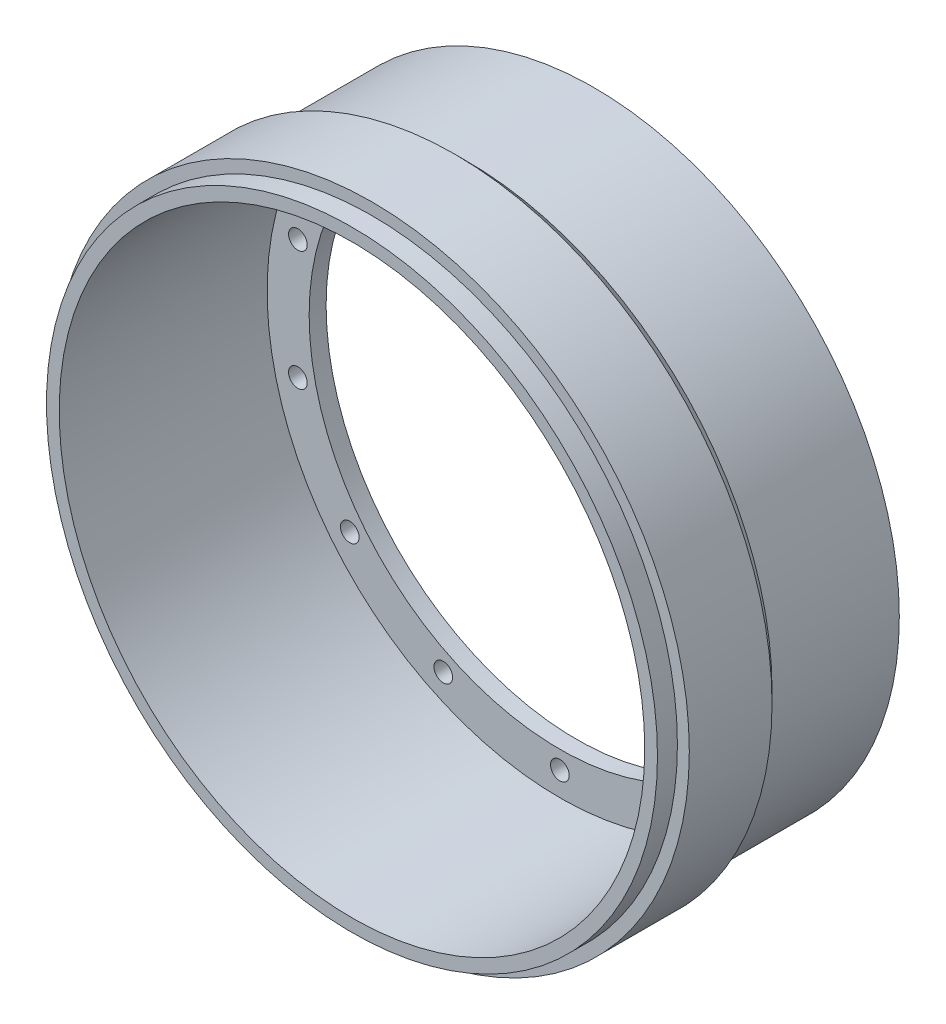
ISO-10303-21;
HEADER;
FILE_DESCRIPTION(('STEP AP214'),'2;1');
FILE_NAME('part.step','',(''),(''),'','','');
FILE_SCHEMA(('AUTOMOTIVE_DESIGN { 1 0 10303 214 1 1 1 1 }'));
ENDSEC;
DATA;
#1=APPLICATION_CONTEXT('core data for automotive mechanical design processes');
#2=APPLICATION_PROTOCOL_DEFINITION('international standard','automotive_design',2000,#1);
#3=PRODUCT_CONTEXT('',#1,'mechanical');
#4=PRODUCT('Part','Part','',(#3));
#5=PRODUCT_RELATED_PRODUCT_CATEGORY('part','',(#4));
#6=PRODUCT_DEFINITION_FORMATION('','',#4);
#7=PRODUCT_DEFINITION_CONTEXT('part definition',#1,'design');
#8=PRODUCT_DEFINITION('design','',#6,#7);
#9=PRODUCT_DEFINITION_SHAPE('','',#8);
#10=(LENGTH_UNIT() NAMED_UNIT(*) SI_UNIT(.MILLI.,.METRE.));
#11=(NAMED_UNIT(*) PLANE_ANGLE_UNIT() SI_UNIT($,.RADIAN.));
#12=(NAMED_UNIT(*) SI_UNIT($,.STERADIAN.) SOLID_ANGLE_UNIT());
#13=UNCERTAINTY_MEASURE_WITH_UNIT(LENGTH_MEASURE(1.E-05),#10,'distance_accuracy_value','');
#14=(GEOMETRIC_REPRESENTATION_CONTEXT(3) GLOBAL_UNCERTAINTY_ASSIGNED_CONTEXT((#13)) GLOBAL_UNIT_ASSIGNED_CONTEXT((#10,
#11,#12)) REPRESENTATION_CONTEXT('',''));
#15=CARTESIAN_POINT('',(0.,0.,0.));
#16=DIRECTION('',(0.,0.,1.));
#17=DIRECTION('',(1.,0.,0.));
#18=AXIS2_PLACEMENT_3D('',#15,#16,#17);
#19=CARTESIAN_POINT('',(0.,0.,14.8358707031366));
#20=DIRECTION('',(0.,0.,1.));
#21=DIRECTION('',(1.,0.,0.));
#22=AXIS2_PLACEMENT_3D('',#19,#20,#21);
#23=CYLINDRICAL_SURFACE('',#22,34.5);
#24=CARTESIAN_POINT('',(0.,0.,0.));
#25=DIRECTION('',(0.,0.,1.));
#26=DIRECTION('',(1.,0.,0.));
#27=AXIS2_PLACEMENT_3D('',#24,#25,#26);
#28=CIRCLE('',#27,34.5);
#29=CARTESIAN_POINT('',(34.5,0.,0.));
#30=VERTEX_POINT('',#29);
#31=EDGE_CURVE('E10',#30,#30,#28,.T.);
#32=ORIENTED_EDGE('',*,*,#31,.F.);
#33=EDGE_LOOP('',(#32));
#34=FACE_BOUND('',#33,.T.);
#35=CARTESIAN_POINT('',(0.,0.,2.));
#36=DIRECTION('',(0.,0.,1.));
#37=DIRECTION('',(1.,0.,0.));
#38=AXIS2_PLACEMENT_3D('',#35,#36,#37);
#39=CIRCLE('',#38,34.5);
#40=CARTESIAN_POINT('',(34.5,0.,2.));
#41=VERTEX_POINT('',#40);
#42=EDGE_CURVE('E87',#41,#41,#39,.T.);
#43=ORIENTED_EDGE('',*,*,#42,.T.);
#44=EDGE_LOOP('',(#43));
#45=FACE_BOUND('',#44,.T.);
#46=ADVANCED_FACE('F30',(#34,#45),#23,.F.);
#47=CARTESIAN_POINT('',(0.,34.5,0.));
#48=DIRECTION('',(0.,0.,1.));
#49=DIRECTION('',(1.,0.,0.));
#50=AXIS2_PLACEMENT_3D('',#47,#48,#49);
#51=PLANE('',#50);
#52=CARTESIAN_POINT('',(0.,0.,0.));
#53=DIRECTION('',(0.,0.,1.));
#54=DIRECTION('',(1.,0.,0.));
#55=AXIS2_PLACEMENT_3D('',#52,#53,#54);
#56=CIRCLE('',#55,36.);
#57=CARTESIAN_POINT('',(36.,0.,0.));
#58=VERTEX_POINT('',#57);
#59=EDGE_CURVE('E37',#58,#58,#56,.T.);
#60=ORIENTED_EDGE('',*,*,#59,.F.);
#61=EDGE_LOOP('',(#60));
#62=FACE_BOUND('',#61,.T.);
#63=ORIENTED_EDGE('',*,*,#31,.T.);
#64=EDGE_LOOP('',(#63));
#65=FACE_BOUND('',#64,.T.);
#66=ADVANCED_FACE('F129',(#62,#65),#51,.F.);
#67=CARTESIAN_POINT('',(0.,0.,14.8358707031366));
#68=DIRECTION('',(0.,0.,1.));
#69=DIRECTION('',(1.,0.,0.));
#70=AXIS2_PLACEMENT_3D('',#67,#68,#69);
#71=CYLINDRICAL_SURFACE('',#70,36.);
#72=CARTESIAN_POINT('',(0.,0.,15.));
#73=DIRECTION('',(0.,0.,1.));
#74=DIRECTION('',(1.,0.,0.));
#75=AXIS2_PLACEMENT_3D('',#72,#73,#74);
#76=CIRCLE('',#75,36.);
#77=CARTESIAN_POINT('',(36.,0.,15.));
#78=VERTEX_POINT('',#77);
#79=EDGE_CURVE('E42',#78,#78,#76,.T.);
#80=ORIENTED_EDGE('',*,*,#79,.F.);
#81=EDGE_LOOP('',(#80));
#82=FACE_BOUND('',#81,.T.);
#83=ORIENTED_EDGE('',*,*,#59,.T.);
#84=EDGE_LOOP('',(#83));
#85=FACE_BOUND('',#84,.T.);
#86=ADVANCED_FACE('F126',(#82,#85),#71,.T.);
#87=CARTESIAN_POINT('',(0.,0.,15.));
#88=DIRECTION('',(0.,0.,1.));
#89=DIRECTION('',(1.,0.,0.));
#90=AXIS2_PLACEMENT_3D('',#87,#88,#89);
#91=CONICAL_SURFACE('',#90,36.,0.78539816339745);
#92=CARTESIAN_POINT('',(0.,0.,16.4));
#93=DIRECTION('',(0.,0.,1.));
#94=DIRECTION('',(1.,0.,0.));
#95=AXIS2_PLACEMENT_3D('',#92,#93,#94);
#96=CIRCLE('',#95,37.4);
#97=CARTESIAN_POINT('',(37.4,0.,16.4));
#98=VERTEX_POINT('',#97);
#99=EDGE_CURVE('E119',#98,#98,#96,.T.);
#100=ORIENTED_EDGE('',*,*,#99,.F.);
#101=EDGE_LOOP('',(#100));
#102=FACE_BOUND('',#101,.T.);
#103=ORIENTED_EDGE('',*,*,#79,.T.);
#104=EDGE_LOOP('',(#103));
#105=FACE_BOUND('',#104,.T.);
#106=ADVANCED_FACE('F124',(#102,#105),#91,.T.);
#107=CARTESIAN_POINT('',(0.,0.,14.8358707031366));
#108=DIRECTION('',(0.,0.,1.));
#109=DIRECTION('',(1.,0.,0.));
#110=AXIS2_PLACEMENT_3D('',#107,#108,#109);
#111=CYLINDRICAL_SURFACE('',#110,37.4);
#112=CARTESIAN_POINT('',(0.,0.,26.15));
#113=DIRECTION('',(0.,0.,1.));
#114=DIRECTION('',(1.,0.,0.));
#115=AXIS2_PLACEMENT_3D('',#112,#113,#114);
#116=CIRCLE('',#115,37.4);
#117=CARTESIAN_POINT('',(37.4,0.,26.15));
#118=VERTEX_POINT('',#117);
#119=EDGE_CURVE('E116',#118,#118,#116,.T.);
#120=ORIENTED_EDGE('',*,*,#119,.F.);
#121=EDGE_LOOP('',(#120));
#122=FACE_BOUND('',#121,.T.);
#123=ORIENTED_EDGE('',*,*,#99,.T.);
#124=EDGE_LOOP('',(#123));
#125=FACE_BOUND('',#124,.T.);
#126=ADVANCED_FACE('F141',(#122,#125),#111,.T.);
#127=CARTESIAN_POINT('',(0.,37.4,26.15));
#128=DIRECTION('',(0.,0.,-1.));
#129=DIRECTION('',(-1.,0.,0.));
#130=AXIS2_PLACEMENT_3D('',#127,#128,#129);
#131=PLANE('',#130);
#132=CARTESIAN_POINT('',(0.,0.,26.15));
#133=DIRECTION('',(0.,0.,1.));
#134=DIRECTION('',(1.,0.,0.));
#135=AXIS2_PLACEMENT_3D('',#132,#133,#134);
#136=CIRCLE('',#135,36.);
#137=CARTESIAN_POINT('',(36.,0.,26.15));
#138=VERTEX_POINT('',#137);
#139=EDGE_CURVE('E113',#138,#138,#136,.T.);
#140=ORIENTED_EDGE('',*,*,#139,.F.);
#141=EDGE_LOOP('',(#140));
#142=FACE_BOUND('',#141,.T.);
#143=ORIENTED_EDGE('',*,*,#119,.T.);
#144=EDGE_LOOP('',(#143));
#145=FACE_BOUND('',#144,.T.);
#146=ADVANCED_FACE('F145',(#142,#145),#131,.F.);
#147=CARTESIAN_POINT('',(0.,0.,14.8358707031366));
#148=DIRECTION('',(0.,0.,1.));
#149=DIRECTION('',(1.,0.,0.));
#150=AXIS2_PLACEMENT_3D('',#147,#148,#149);
#151=CYLINDRICAL_SURFACE('',#150,36.);
#152=CARTESIAN_POINT('',(0.,0.,28.5));
#153=DIRECTION('',(0.,0.,1.));
#154=DIRECTION('',(1.,0.,0.));
#155=AXIS2_PLACEMENT_3D('',#152,#153,#154);
#156=CIRCLE('',#155,36.);
#157=CARTESIAN_POINT('',(36.,0.,28.5));
#158=VERTEX_POINT('',#157);
#159=EDGE_CURVE('E110',#158,#158,#156,.T.);
#160=ORIENTED_EDGE('',*,*,#159,.F.);
#161=EDGE_LOOP('',(#160));
#162=FACE_BOUND('',#161,.T.);
#163=ORIENTED_EDGE('',*,*,#139,.T.);
#164=EDGE_LOOP('',(#163));
#165=FACE_BOUND('',#164,.T.);
#166=ADVANCED_FACE('F149',(#162,#165),#151,.T.);
#167=CARTESIAN_POINT('',(0.,36.,28.5));
#168=DIRECTION('',(0.,0.,-1.));
#169=DIRECTION('',(-1.,0.,0.));
#170=AXIS2_PLACEMENT_3D('',#167,#168,#169);
#171=PLANE('',#170);
#172=CARTESIAN_POINT('',(0.,0.,28.5));
#173=DIRECTION('',(0.,0.,1.));
#174=DIRECTION('',(1.,0.,0.));
#175=AXIS2_PLACEMENT_3D('',#172,#173,#174);
#176=CIRCLE('',#175,34.5);
#177=CARTESIAN_POINT('',(34.5,0.,28.5));
#178=VERTEX_POINT('',#177);
#179=EDGE_CURVE('E107',#178,#178,#176,.T.);
#180=ORIENTED_EDGE('',*,*,#179,.F.);
#181=EDGE_LOOP('',(#180));
#182=FACE_BOUND('',#181,.T.);
#183=ORIENTED_EDGE('',*,*,#159,.T.);
#184=EDGE_LOOP('',(#183));
#185=FACE_BOUND('',#184,.T.);
#186=ADVANCED_FACE('F153',(#182,#185),#171,.F.);
#187=CARTESIAN_POINT('',(0.,0.,14.8358707031366));
#188=DIRECTION('',(0.,0.,1.));
#189=DIRECTION('',(1.,0.,0.));
#190=AXIS2_PLACEMENT_3D('',#187,#188,#189);
#191=CYLINDRICAL_SURFACE('',#190,34.5);
#192=CARTESIAN_POINT('',(0.,0.,4.));
#193=DIRECTION('',(0.,0.,1.));
#194=DIRECTION('',(1.,0.,0.));
#195=AXIS2_PLACEMENT_3D('',#192,#193,#194);
#196=CIRCLE('',#195,34.5);
#197=CARTESIAN_POINT('',(34.5,0.,4.));
#198=VERTEX_POINT('',#197);
#199=EDGE_CURVE('E104',#198,#198,#196,.T.);
#200=ORIENTED_EDGE('',*,*,#199,.F.);
#201=EDGE_LOOP('',(#200));
#202=FACE_BOUND('',#201,.T.);
#203=ORIENTED_EDGE('',*,*,#179,.T.);
#204=EDGE_LOOP('',(#203));
#205=FACE_BOUND('',#204,.T.);
#206=ADVANCED_FACE('F157',(#202,#205),#191,.F.);
#207=CARTESIAN_POINT('',(0.,34.5,4.));
#208=DIRECTION('',(0.,0.,-1.));
#209=DIRECTION('',(-1.,0.,0.));
#210=AXIS2_PLACEMENT_3D('',#207,#208,#209);
#211=PLANE('',#210);
#212=CARTESIAN_POINT('',(0.,31.67,4.));
#213=DIRECTION('',(0.,0.,1.));
#214=DIRECTION('',(1.,0.,0.));
#215=AXIS2_PLACEMENT_3D('',#212,#213,#214);
#216=CIRCLE('',#215,1.1);
#217=CARTESIAN_POINT('',(1.1,31.67,4.));
#218=VERTEX_POINT('',#217);
#219=EDGE_CURVE('E50',#218,#218,#216,.T.);
#220=ORIENTED_EDGE('',*,*,#219,.F.);
#221=EDGE_LOOP('',(#220));
#222=FACE_BOUND('',#221,.T.);
#223=CARTESIAN_POINT('',(-13.7410980178525,28.5336840464673,4.));
#224=DIRECTION('',(0.,0.,1.));
#225=DIRECTION('',(1.,0.,0.));
#226=AXIS2_PLACEMENT_3D('',#223,#224,#225);
#227=CIRCLE('',#226,1.10000000000161);
#228=CARTESIAN_POINT('',(-12.6410980178509,28.5336840464673,4.));
#229=VERTEX_POINT('',#228);
#230=EDGE_CURVE('E251',#229,#229,#227,.T.);
#231=ORIENTED_EDGE('',*,*,#230,.F.);
#232=EDGE_LOOP('',(#231));
#233=FACE_BOUND('',#232,.T.);
#234=CARTESIAN_POINT('',(-24.7606030497605,19.7459220248619,4.));
#235=DIRECTION('',(0.,0.,1.));
#236=DIRECTION('',(1.,0.,0.));
#237=AXIS2_PLACEMENT_3D('',#234,#235,#236);
#238=CIRCLE('',#237,1.10000000000356);
#239=CARTESIAN_POINT('',(-23.6606030497569,19.7459220248619,4.));
#240=VERTEX_POINT('',#239);
#241=EDGE_CURVE('E248',#240,#240,#238,.T.);
#242=ORIENTED_EDGE('',*,*,#241,.F.);
#243=EDGE_LOOP('',(#242));
#244=FACE_BOUND('',#243,.T.);
#245=CARTESIAN_POINT('',(-30.8759669787942,7.0472379783912,4.));
#246=DIRECTION('',(0.,0.,1.));
#247=DIRECTION('',(1.,0.,0.));
#248=AXIS2_PLACEMENT_3D('',#245,#246,#247);
#249=CIRCLE('',#248,1.10000000000588);
#250=CARTESIAN_POINT('',(-29.7759669787883,7.0472379783912,4.));
#251=VERTEX_POINT('',#250);
#252=EDGE_CURVE('E245',#251,#251,#249,.T.);
#253=ORIENTED_EDGE('',*,*,#252,.F.);
#254=EDGE_LOOP('',(#253));
#255=FACE_BOUND('',#254,.T.);
#256=CARTESIAN_POINT('',(-30.8759669787918,-7.04723797840175,4.));
#257=DIRECTION('',(0.,0.,1.));
#258=DIRECTION('',(1.,0.,0.));
#259=AXIS2_PLACEMENT_3D('',#256,#257,#258);
#260=CIRCLE('',#259,1.10000000000815);
#261=CARTESIAN_POINT('',(-29.7759669787836,-7.04723797840175,4.));
#262=VERTEX_POINT('',#261);
#263=EDGE_CURVE('E242',#262,#262,#260,.T.);
#264=ORIENTED_EDGE('',*,*,#263,.F.);
#265=EDGE_LOOP('',(#264));
#266=FACE_BOUND('',#265,.T.);
#267=CARTESIAN_POINT('',(-24.7606030497537,-19.7459220248703,4.));
#268=DIRECTION('',(0.,0.,1.));
#269=DIRECTION('',(1.,0.,0.));
#270=AXIS2_PLACEMENT_3D('',#267,#268,#269);
#271=CIRCLE('',#270,1.10000000000988);
#272=CARTESIAN_POINT('',(-23.6606030497439,-19.7459220248703,4.));
#273=VERTEX_POINT('',#272);
#274=EDGE_CURVE('E239',#273,#273,#271,.T.);
#275=ORIENTED_EDGE('',*,*,#274,.F.);
#276=EDGE_LOOP('',(#275));
#277=FACE_BOUND('',#276,.T.);
#278=CARTESIAN_POINT('',(-13.7410980178428,-28.533684046472,4.));
#279=DIRECTION('',(0.,0.,1.));
#280=DIRECTION('',(1.,0.,0.));
#281=AXIS2_PLACEMENT_3D('',#278,#279,#280);
#282=CIRCLE('',#281,1.10000000001074);
#283=CARTESIAN_POINT('',(-12.6410980178321,-28.533684046472,4.));
#284=VERTEX_POINT('',#283);
#285=EDGE_CURVE('E99',#284,#284,#282,.T.);
#286=ORIENTED_EDGE('',*,*,#285,.F.);
#287=EDGE_LOOP('',(#286));
#288=FACE_BOUND('',#287,.T.);
#289=CARTESIAN_POINT('',(1.07943542076867E-11,-31.67,4.));
#290=DIRECTION('',(0.,0.,1.));
#291=DIRECTION('',(1.,0.,0.));
#292=AXIS2_PLACEMENT_3D('',#289,#290,#291);
#293=CIRCLE('',#292,1.10000000001053);
#294=CARTESIAN_POINT('',(1.10000000002133,-31.67,4.));
#295=VERTEX_POINT('',#294);
#296=EDGE_CURVE('E267',#295,#295,#293,.T.);
#297=ORIENTED_EDGE('',*,*,#296,.F.);
#298=EDGE_LOOP('',(#297));
#299=FACE_BOUND('',#298,.T.);
#300=CARTESIAN_POINT('',(13.7410980178633,-28.5336840464673,4.));
#301=DIRECTION('',(0.,0.,1.));
#302=DIRECTION('',(1.,0.,0.));
#303=AXIS2_PLACEMENT_3D('',#300,#301,#302);
#304=CIRCLE('',#303,1.10000000000931);
#305=CARTESIAN_POINT('',(14.8410980178726,-28.5336840464673,4.));
#306=VERTEX_POINT('',#305);
#307=EDGE_CURVE('E265',#306,#306,#304,.T.);
#308=ORIENTED_EDGE('',*,*,#307,.F.);
#309=EDGE_LOOP('',(#308));
#310=FACE_BOUND('',#309,.T.);
#311=CARTESIAN_POINT('',(24.7606030497713,-19.7459220248619,4.));
#312=DIRECTION('',(0.,0.,1.));
#313=DIRECTION('',(1.,0.,0.));
#314=AXIS2_PLACEMENT_3D('',#311,#312,#313);
#315=CIRCLE('',#314,1.10000000000728);
#316=CARTESIAN_POINT('',(25.8606030497785,-19.7459220248619,4.));
#317=VERTEX_POINT('',#316);
#318=EDGE_CURVE('E262',#317,#317,#315,.T.);
#319=ORIENTED_EDGE('',*,*,#318,.F.);
#320=EDGE_LOOP('',(#319));
#321=FACE_BOUND('',#320,.T.);
#322=CARTESIAN_POINT('',(30.8759669788049,-7.04723797839122,4.));
#323=DIRECTION('',(0.,0.,1.));
#324=DIRECTION('',(1.,0.,0.));
#325=AXIS2_PLACEMENT_3D('',#322,#323,#324);
#326=CIRCLE('',#325,1.10000000000488);
#327=CARTESIAN_POINT('',(31.9759669788098,-7.04723797839122,4.));
#328=VERTEX_POINT('',#327);
#329=EDGE_CURVE('E259',#328,#328,#326,.T.);
#330=ORIENTED_EDGE('',*,*,#329,.F.);
#331=EDGE_LOOP('',(#330));
#332=FACE_BOUND('',#331,.T.);
#333=CARTESIAN_POINT('',(30.8759669788025,7.04723797840173,4.));
#334=DIRECTION('',(0.,0.,1.));
#335=DIRECTION('',(1.,0.,0.));
#336=AXIS2_PLACEMENT_3D('',#333,#334,#335);
#337=CIRCLE('',#336,1.10000000000256);
#338=CARTESIAN_POINT('',(31.9759669788051,7.04723797840173,4.));
#339=VERTEX_POINT('',#338);
#340=EDGE_CURVE('E256',#339,#339,#337,.T.);
#341=ORIENTED_EDGE('',*,*,#340,.F.);
#342=EDGE_LOOP('',(#341));
#343=FACE_BOUND('',#342,.T.);
#344=CARTESIAN_POINT('',(24.7606030497645,19.7459220248703,4.));
#345=DIRECTION('',(0.,0.,1.));
#346=DIRECTION('',(1.,0.,0.));
#347=AXIS2_PLACEMENT_3D('',#344,#345,#346);
#348=CIRCLE('',#347,1.10000000000077);
#349=CARTESIAN_POINT('',(25.8606030497653,19.7459220248703,4.));
#350=VERTEX_POINT('',#349);
#351=EDGE_CURVE('E236',#350,#350,#348,.T.);
#352=ORIENTED_EDGE('',*,*,#351,.F.);
#353=EDGE_LOOP('',(#352));
#354=FACE_BOUND('',#353,.T.);
#355=CARTESIAN_POINT('',(13.7410980178536,28.5336840464719,4.));
#356=DIRECTION('',(0.,0.,1.));
#357=DIRECTION('',(1.,0.,0.));
#358=AXIS2_PLACEMENT_3D('',#355,#356,#357);
#359=CIRCLE('',#358,1.09999999999986);
#360=CARTESIAN_POINT('',(14.8410980178535,28.5336840464719,4.));
#361=VERTEX_POINT('',#360);
#362=EDGE_CURVE('E233',#361,#361,#359,.T.);
#363=ORIENTED_EDGE('',*,*,#362,.F.);
#364=EDGE_LOOP('',(#363));
#365=FACE_BOUND('',#364,.T.);
#366=CARTESIAN_POINT('',(0.,0.,4.));
#367=DIRECTION('',(0.,0.,1.));
#368=DIRECTION('',(1.,0.,0.));
#369=AXIS2_PLACEMENT_3D('',#366,#367,#368);
#370=CIRCLE('',#369,29.55);
#371=CARTESIAN_POINT('',(29.55,0.,4.));
#372=VERTEX_POINT('',#371);
#373=EDGE_CURVE('E96',#372,#372,#370,.T.);
#374=ORIENTED_EDGE('',*,*,#373,.F.);
#375=EDGE_LOOP('',(#374));
#376=FACE_BOUND('',#375,.T.);
#377=ORIENTED_EDGE('',*,*,#199,.T.);
#378=EDGE_LOOP('',(#377));
#379=FACE_BOUND('',#378,.T.);
#380=ADVANCED_FACE('F161',(#222,#233,#244,#255,#266,#277,#288,#299,#310,#321,#332,#343,#354,
#365,#376,#379),#211,.F.);
#381=CARTESIAN_POINT('',(0.,0.,14.8358707031366));
#382=DIRECTION('',(0.,0.,1.));
#383=DIRECTION('',(1.,0.,0.));
#384=AXIS2_PLACEMENT_3D('',#381,#382,#383);
#385=CYLINDRICAL_SURFACE('',#384,29.55);
#386=CARTESIAN_POINT('',(0.,0.,2.));
#387=DIRECTION('',(0.,0.,1.));
#388=DIRECTION('',(1.,0.,0.));
#389=AXIS2_PLACEMENT_3D('',#386,#387,#388);
#390=CIRCLE('',#389,29.55);
#391=CARTESIAN_POINT('',(29.55,0.,2.));
#392=VERTEX_POINT('',#391);
#393=EDGE_CURVE('E91',#392,#392,#390,.T.);
#394=ORIENTED_EDGE('',*,*,#393,.F.);
#395=EDGE_LOOP('',(#394));
#396=FACE_BOUND('',#395,.T.);
#397=ORIENTED_EDGE('',*,*,#373,.T.);
#398=EDGE_LOOP('',(#397));
#399=FACE_BOUND('',#398,.T.);
#400=ADVANCED_FACE('F165',(#396,#399),#385,.F.);
#401=CARTESIAN_POINT('',(0.,29.55,2.));
#402=DIRECTION('',(0.,0.,1.));
#403=DIRECTION('',(1.,0.,0.));
#404=AXIS2_PLACEMENT_3D('',#401,#402,#403);
#405=PLANE('',#404);
#406=CARTESIAN_POINT('',(0.,31.67,2.));
#407=DIRECTION('',(0.,0.,1.));
#408=DIRECTION('',(1.,0.,0.));
#409=AXIS2_PLACEMENT_3D('',#406,#407,#408);
#410=CIRCLE('',#409,1.1);
#411=CARTESIAN_POINT('',(1.1,31.67,2.));
#412=VERTEX_POINT('',#411);
#413=EDGE_CURVE('E33',#412,#412,#410,.T.);
#414=ORIENTED_EDGE('',*,*,#413,.T.);
#415=EDGE_LOOP('',(#414));
#416=FACE_BOUND('',#415,.T.);
#417=CARTESIAN_POINT('',(-13.7410980178525,28.5336840464673,2.));
#418=DIRECTION('',(0.,0.,1.));
#419=DIRECTION('',(1.,0.,0.));
#420=AXIS2_PLACEMENT_3D('',#417,#418,#419);
#421=CIRCLE('',#420,1.10000000000161);
#422=CARTESIAN_POINT('',(-12.6410980178509,28.5336840464673,2.));
#423=VERTEX_POINT('',#422);
#424=EDGE_CURVE('E82',#423,#423,#421,.T.);
#425=ORIENTED_EDGE('',*,*,#424,.T.);
#426=EDGE_LOOP('',(#425));
#427=FACE_BOUND('',#426,.T.);
#428=CARTESIAN_POINT('',(-24.7606030497605,19.7459220248619,2.));
#429=DIRECTION('',(0.,0.,1.));
#430=DIRECTION('',(1.,0.,0.));
#431=AXIS2_PLACEMENT_3D('',#428,#429,#430);
#432=CIRCLE('',#431,1.10000000000356);
#433=CARTESIAN_POINT('',(-23.6606030497569,19.7459220248619,2.));
#434=VERTEX_POINT('',#433);
#435=EDGE_CURVE('E80',#434,#434,#432,.T.);
#436=ORIENTED_EDGE('',*,*,#435,.T.);
#437=EDGE_LOOP('',(#436));
#438=FACE_BOUND('',#437,.T.);
#439=CARTESIAN_POINT('',(-30.8759669787942,7.0472379783912,2.));
#440=DIRECTION('',(0.,0.,1.));
#441=DIRECTION('',(1.,0.,0.));
#442=AXIS2_PLACEMENT_3D('',#439,#440,#441);
#443=CIRCLE('',#442,1.10000000000588);
#444=CARTESIAN_POINT('',(-29.7759669787883,7.0472379783912,2.));
#445=VERTEX_POINT('',#444);
#446=EDGE_CURVE('E77',#445,#445,#443,.T.);
#447=ORIENTED_EDGE('',*,*,#446,.T.);
#448=EDGE_LOOP('',(#447));
#449=FACE_BOUND('',#448,.T.);
#450=CARTESIAN_POINT('',(-30.8759669787918,-7.04723797840175,2.));
#451=DIRECTION('',(0.,0.,1.));
#452=DIRECTION('',(1.,0.,0.));
#453=AXIS2_PLACEMENT_3D('',#450,#451,#452);
#454=CIRCLE('',#453,1.10000000000815);
#455=CARTESIAN_POINT('',(-29.7759669787836,-7.04723797840175,2.));
#456=VERTEX_POINT('',#455);
#457=EDGE_CURVE('E74',#456,#456,#454,.T.);
#458=ORIENTED_EDGE('',*,*,#457,.T.);
#459=EDGE_LOOP('',(#458));
#460=FACE_BOUND('',#459,.T.);
#461=CARTESIAN_POINT('',(-24.7606030497537,-19.7459220248703,2.));
#462=DIRECTION('',(0.,0.,1.));
#463=DIRECTION('',(1.,0.,0.));
#464=AXIS2_PLACEMENT_3D('',#461,#462,#463);
#465=CIRCLE('',#464,1.10000000000988);
#466=CARTESIAN_POINT('',(-23.6606030497439,-19.7459220248703,2.));
#467=VERTEX_POINT('',#466);
#468=EDGE_CURVE('E71',#467,#467,#465,.T.);
#469=ORIENTED_EDGE('',*,*,#468,.T.);
#470=EDGE_LOOP('',(#469));
#471=FACE_BOUND('',#470,.T.);
#472=CARTESIAN_POINT('',(-13.7410980178428,-28.533684046472,2.));
#473=DIRECTION('',(0.,0.,1.));
#474=DIRECTION('',(1.,0.,0.));
#475=AXIS2_PLACEMENT_3D('',#472,#473,#474);
#476=CIRCLE('',#475,1.10000000001074);
#477=CARTESIAN_POINT('',(-12.6410980178321,-28.533684046472,2.));
#478=VERTEX_POINT('',#477);
#479=EDGE_CURVE('E68',#478,#478,#476,.T.);
#480=ORIENTED_EDGE('',*,*,#479,.T.);
#481=EDGE_LOOP('',(#480));
#482=FACE_BOUND('',#481,.T.);
#483=CARTESIAN_POINT('',(1.07943542076867E-11,-31.67,2.));
#484=DIRECTION('',(0.,0.,1.));
#485=DIRECTION('',(1.,0.,0.));
#486=AXIS2_PLACEMENT_3D('',#483,#484,#485);
#487=CIRCLE('',#486,1.10000000001053);
#488=CARTESIAN_POINT('',(1.10000000002133,-31.67,2.));
#489=VERTEX_POINT('',#488);
#490=EDGE_CURVE('E65',#489,#489,#487,.T.);
#491=ORIENTED_EDGE('',*,*,#490,.T.);
#492=EDGE_LOOP('',(#491));
#493=FACE_BOUND('',#492,.T.);
#494=CARTESIAN_POINT('',(13.7410980178633,-28.5336840464673,2.));
#495=DIRECTION('',(0.,0.,1.));
#496=DIRECTION('',(1.,0.,0.));
#497=AXIS2_PLACEMENT_3D('',#494,#495,#496);
#498=CIRCLE('',#497,1.10000000000931);
#499=CARTESIAN_POINT('',(14.8410980178726,-28.5336840464673,2.));
#500=VERTEX_POINT('',#499);
#501=EDGE_CURVE('E62',#500,#500,#498,.T.);
#502=ORIENTED_EDGE('',*,*,#501,.T.);
#503=EDGE_LOOP('',(#502));
#504=FACE_BOUND('',#503,.T.);
#505=CARTESIAN_POINT('',(24.7606030497713,-19.7459220248619,2.));
#506=DIRECTION('',(0.,0.,1.));
#507=DIRECTION('',(1.,0.,0.));
#508=AXIS2_PLACEMENT_3D('',#505,#506,#507);
#509=CIRCLE('',#508,1.10000000000728);
#510=CARTESIAN_POINT('',(25.8606030497785,-19.7459220248619,2.));
#511=VERTEX_POINT('',#510);
#512=EDGE_CURVE('E59',#511,#511,#509,.T.);
#513=ORIENTED_EDGE('',*,*,#512,.T.);
#514=EDGE_LOOP('',(#513));
#515=FACE_BOUND('',#514,.T.);
#516=CARTESIAN_POINT('',(30.8759669788049,-7.04723797839122,2.));
#517=DIRECTION('',(0.,0.,1.));
#518=DIRECTION('',(1.,0.,0.));
#519=AXIS2_PLACEMENT_3D('',#516,#517,#518);
#520=CIRCLE('',#519,1.10000000000488);
#521=CARTESIAN_POINT('',(31.9759669788098,-7.04723797839122,2.));
#522=VERTEX_POINT('',#521);
#523=EDGE_CURVE('E56',#522,#522,#520,.T.);
#524=ORIENTED_EDGE('',*,*,#523,.T.);
#525=EDGE_LOOP('',(#524));
#526=FACE_BOUND('',#525,.T.);
#527=CARTESIAN_POINT('',(30.8759669788025,7.04723797840173,2.));
#528=DIRECTION('',(0.,0.,1.));
#529=DIRECTION('',(1.,0.,0.));
#530=AXIS2_PLACEMENT_3D('',#527,#528,#529);
#531=CIRCLE('',#530,1.10000000000256);
#532=CARTESIAN_POINT('',(31.9759669788051,7.04723797840173,2.));
#533=VERTEX_POINT('',#532);
#534=EDGE_CURVE('E53',#533,#533,#531,.T.);
#535=ORIENTED_EDGE('',*,*,#534,.T.);
#536=EDGE_LOOP('',(#535));
#537=FACE_BOUND('',#536,.T.);
#538=CARTESIAN_POINT('',(24.7606030497645,19.7459220248703,2.));
#539=DIRECTION('',(0.,0.,1.));
#540=DIRECTION('',(1.,0.,0.));
#541=AXIS2_PLACEMENT_3D('',#538,#539,#540);
#542=CIRCLE('',#541,1.10000000000077);
#543=CARTESIAN_POINT('',(25.8606030497653,19.7459220248703,2.));
#544=VERTEX_POINT('',#543);
#545=EDGE_CURVE('E49',#544,#544,#542,.T.);
#546=ORIENTED_EDGE('',*,*,#545,.T.);
#547=EDGE_LOOP('',(#546));
#548=FACE_BOUND('',#547,.T.);
#549=CARTESIAN_POINT('',(13.7410980178536,28.5336840464719,2.));
#550=DIRECTION('',(0.,0.,1.));
#551=DIRECTION('',(1.,0.,0.));
#552=AXIS2_PLACEMENT_3D('',#549,#550,#551);
#553=CIRCLE('',#552,1.09999999999986);
#554=CARTESIAN_POINT('',(14.8410980178535,28.5336840464719,2.));
#555=VERTEX_POINT('',#554);
#556=EDGE_CURVE('E46',#555,#555,#553,.T.);
#557=ORIENTED_EDGE('',*,*,#556,.T.);
#558=EDGE_LOOP('',(#557));
#559=FACE_BOUND('',#558,.T.);
#560=ORIENTED_EDGE('',*,*,#42,.F.);
#561=EDGE_LOOP('',(#560));
#562=FACE_BOUND('',#561,.T.);
#563=ORIENTED_EDGE('',*,*,#393,.T.);
#564=EDGE_LOOP('',(#563));
#565=FACE_BOUND('',#564,.T.);
#566=ADVANCED_FACE('F169',(#416,#427,#438,#449,#460,#471,#482,#493,#504,#515,#526,#537,#548,
#559,#562,#565),#405,.F.);
#567=CARTESIAN_POINT('',(13.7410980178536,28.5336840464719,0.));
#568=DIRECTION('',(0.,0.,1.));
#569=DIRECTION('',(1.,0.,0.));
#570=AXIS2_PLACEMENT_3D('',#567,#568,#569);
#571=CYLINDRICAL_SURFACE('',#570,1.09999999999986);
#572=ORIENTED_EDGE('',*,*,#362,.T.);
#573=EDGE_LOOP('',(#572));
#574=FACE_BOUND('',#573,.T.);
#575=ORIENTED_EDGE('',*,*,#556,.F.);
#576=EDGE_LOOP('',(#575));
#577=FACE_BOUND('',#576,.T.);
#578=ADVANCED_FACE('F173',(#574,#577),#571,.F.);
#579=CARTESIAN_POINT('',(24.7606030497645,19.7459220248703,0.));
#580=DIRECTION('',(0.,0.,1.));
#581=DIRECTION('',(1.,0.,0.));
#582=AXIS2_PLACEMENT_3D('',#579,#580,#581);
#583=CYLINDRICAL_SURFACE('',#582,1.10000000000077);
#584=ORIENTED_EDGE('',*,*,#351,.T.);
#585=EDGE_LOOP('',(#584));
#586=FACE_BOUND('',#585,.T.);
#587=ORIENTED_EDGE('',*,*,#545,.F.);
#588=EDGE_LOOP('',(#587));
#589=FACE_BOUND('',#588,.T.);
#590=ADVANCED_FACE('F198',(#586,#589),#583,.F.);
#591=CARTESIAN_POINT('',(30.8759669788025,7.04723797840173,0.));
#592=DIRECTION('',(0.,0.,1.));
#593=DIRECTION('',(1.,0.,0.));
#594=AXIS2_PLACEMENT_3D('',#591,#592,#593);
#595=CYLINDRICAL_SURFACE('',#594,1.10000000000256);
#596=ORIENTED_EDGE('',*,*,#340,.T.);
#597=EDGE_LOOP('',(#596));
#598=FACE_BOUND('',#597,.T.);
#599=ORIENTED_EDGE('',*,*,#534,.F.);
#600=EDGE_LOOP('',(#599));
#601=FACE_BOUND('',#600,.T.);
#602=ADVANCED_FACE('F194',(#598,#601),#595,.F.);
#603=CARTESIAN_POINT('',(30.8759669788049,-7.04723797839122,0.));
#604=DIRECTION('',(0.,0.,1.));
#605=DIRECTION('',(1.,0.,0.));
#606=AXIS2_PLACEMENT_3D('',#603,#604,#605);
#607=CYLINDRICAL_SURFACE('',#606,1.10000000000488);
#608=ORIENTED_EDGE('',*,*,#329,.T.);
#609=EDGE_LOOP('',(#608));
#610=FACE_BOUND('',#609,.T.);
#611=ORIENTED_EDGE('',*,*,#523,.F.);
#612=EDGE_LOOP('',(#611));
#613=FACE_BOUND('',#612,.T.);
#614=ADVANCED_FACE('F190',(#610,#613),#607,.F.);
#615=CARTESIAN_POINT('',(24.7606030497713,-19.7459220248619,0.));
#616=DIRECTION('',(0.,0.,1.));
#617=DIRECTION('',(1.,0.,0.));
#618=AXIS2_PLACEMENT_3D('',#615,#616,#617);
#619=CYLINDRICAL_SURFACE('',#618,1.10000000000728);
#620=ORIENTED_EDGE('',*,*,#318,.T.);
#621=EDGE_LOOP('',(#620));
#622=FACE_BOUND('',#621,.T.);
#623=ORIENTED_EDGE('',*,*,#512,.F.);
#624=EDGE_LOOP('',(#623));
#625=FACE_BOUND('',#624,.T.);
#626=ADVANCED_FACE('F186',(#622,#625),#619,.F.);
#627=CARTESIAN_POINT('',(13.7410980178633,-28.5336840464673,0.));
#628=DIRECTION('',(0.,0.,1.));
#629=DIRECTION('',(1.,0.,0.));
#630=AXIS2_PLACEMENT_3D('',#627,#628,#629);
#631=CYLINDRICAL_SURFACE('',#630,1.10000000000931);
#632=ORIENTED_EDGE('',*,*,#307,.T.);
#633=EDGE_LOOP('',(#632));
#634=FACE_BOUND('',#633,.T.);
#635=ORIENTED_EDGE('',*,*,#501,.F.);
#636=EDGE_LOOP('',(#635));
#637=FACE_BOUND('',#636,.T.);
#638=ADVANCED_FACE('F182',(#634,#637),#631,.F.);
#639=CARTESIAN_POINT('',(1.07943542076867E-11,-31.67,0.));
#640=DIRECTION('',(0.,0.,1.));
#641=DIRECTION('',(1.,0.,0.));
#642=AXIS2_PLACEMENT_3D('',#639,#640,#641);
#643=CYLINDRICAL_SURFACE('',#642,1.10000000001053);
#644=ORIENTED_EDGE('',*,*,#296,.T.);
#645=EDGE_LOOP('',(#644));
#646=FACE_BOUND('',#645,.T.);
#647=ORIENTED_EDGE('',*,*,#490,.F.);
#648=EDGE_LOOP('',(#647));
#649=FACE_BOUND('',#648,.T.);
#650=ADVANCED_FACE('F178',(#646,#649),#643,.F.);
#651=CARTESIAN_POINT('',(-13.7410980178428,-28.533684046472,0.));
#652=DIRECTION('',(0.,0.,1.));
#653=DIRECTION('',(1.,0.,0.));
#654=AXIS2_PLACEMENT_3D('',#651,#652,#653);
#655=CYLINDRICAL_SURFACE('',#654,1.10000000001074);
#656=ORIENTED_EDGE('',*,*,#285,.T.);
#657=EDGE_LOOP('',(#656));
#658=FACE_BOUND('',#657,.T.);
#659=ORIENTED_EDGE('',*,*,#479,.F.);
#660=EDGE_LOOP('',(#659));
#661=FACE_BOUND('',#660,.T.);
#662=ADVANCED_FACE('F174',(#658,#661),#655,.F.);
#663=CARTESIAN_POINT('',(-24.7606030497537,-19.7459220248703,0.));
#664=DIRECTION('',(0.,0.,1.));
#665=DIRECTION('',(1.,0.,0.));
#666=AXIS2_PLACEMENT_3D('',#663,#664,#665);
#667=CYLINDRICAL_SURFACE('',#666,1.10000000000988);
#668=ORIENTED_EDGE('',*,*,#274,.T.);
#669=EDGE_LOOP('',(#668));
#670=FACE_BOUND('',#669,.T.);
#671=ORIENTED_EDGE('',*,*,#468,.F.);
#672=EDGE_LOOP('',(#671));
#673=FACE_BOUND('',#672,.T.);
#674=ADVANCED_FACE('F177',(#670,#673),#667,.F.);
#675=CARTESIAN_POINT('',(-30.8759669787918,-7.04723797840175,0.));
#676=DIRECTION('',(0.,0.,1.));
#677=DIRECTION('',(1.,0.,0.));
#678=AXIS2_PLACEMENT_3D('',#675,#676,#677);
#679=CYLINDRICAL_SURFACE('',#678,1.10000000000815);
#680=ORIENTED_EDGE('',*,*,#263,.T.);
#681=EDGE_LOOP('',(#680));
#682=FACE_BOUND('',#681,.T.);
#683=ORIENTED_EDGE('',*,*,#457,.F.);
#684=EDGE_LOOP('',(#683));
#685=FACE_BOUND('',#684,.T.);
#686=ADVANCED_FACE('F218',(#682,#685),#679,.F.);
#687=CARTESIAN_POINT('',(-30.8759669787942,7.0472379783912,0.));
#688=DIRECTION('',(0.,0.,1.));
#689=DIRECTION('',(1.,0.,0.));
#690=AXIS2_PLACEMENT_3D('',#687,#688,#689);
#691=CYLINDRICAL_SURFACE('',#690,1.10000000000588);
#692=ORIENTED_EDGE('',*,*,#252,.T.);
#693=EDGE_LOOP('',(#692));
#694=FACE_BOUND('',#693,.T.);
#695=ORIENTED_EDGE('',*,*,#446,.F.);
#696=EDGE_LOOP('',(#695));
#697=FACE_BOUND('',#696,.T.);
#698=ADVANCED_FACE('F214',(#694,#697),#691,.F.);
#699=CARTESIAN_POINT('',(-24.7606030497605,19.7459220248619,0.));
#700=DIRECTION('',(0.,0.,1.));
#701=DIRECTION('',(1.,0.,0.));
#702=AXIS2_PLACEMENT_3D('',#699,#700,#701);
#703=CYLINDRICAL_SURFACE('',#702,1.10000000000356);
#704=ORIENTED_EDGE('',*,*,#241,.T.);
#705=EDGE_LOOP('',(#704));
#706=FACE_BOUND('',#705,.T.);
#707=ORIENTED_EDGE('',*,*,#435,.F.);
#708=EDGE_LOOP('',(#707));
#709=FACE_BOUND('',#708,.T.);
#710=ADVANCED_FACE('F210',(#706,#709),#703,.F.);
#711=CARTESIAN_POINT('',(-13.7410980178525,28.5336840464673,0.));
#712=DIRECTION('',(0.,0.,1.));
#713=DIRECTION('',(1.,0.,0.));
#714=AXIS2_PLACEMENT_3D('',#711,#712,#713);
#715=CYLINDRICAL_SURFACE('',#714,1.10000000000161);
#716=ORIENTED_EDGE('',*,*,#230,.T.);
#717=EDGE_LOOP('',(#716));
#718=FACE_BOUND('',#717,.T.);
#719=ORIENTED_EDGE('',*,*,#424,.F.);
#720=EDGE_LOOP('',(#719));
#721=FACE_BOUND('',#720,.T.);
#722=ADVANCED_FACE('F206',(#718,#721),#715,.F.);
#723=CARTESIAN_POINT('',(0.,31.67,0.));
#724=DIRECTION('',(0.,0.,1.));
#725=DIRECTION('',(1.,0.,0.));
#726=AXIS2_PLACEMENT_3D('',#723,#724,#725);
#727=CYLINDRICAL_SURFACE('',#726,1.1);
#728=ORIENTED_EDGE('',*,*,#219,.T.);
#729=EDGE_LOOP('',(#728));
#730=FACE_BOUND('',#729,.T.);
#731=ORIENTED_EDGE('',*,*,#413,.F.);
#732=EDGE_LOOP('',(#731));
#733=FACE_BOUND('',#732,.T.);
#734=ADVANCED_FACE('F209',(#730,#733),#727,.F.);
#735=CLOSED_SHELL('',(#46,#66,#86,#106,#126,#146,#166,#186,#206,#380,#400,#566,#578,#590,#602,
#614,#626,#638,#650,#662,#674,#686,#698,#710,#722,#734));
#736=MANIFOLD_SOLID_BREP('B2',#735);
#737=ADVANCED_BREP_SHAPE_REPRESENTATION('',(#18,#736),#14);
#738=SHAPE_DEFINITION_REPRESENTATION(#9,#737);
ENDSEC;
END-ISO-10303-21;
